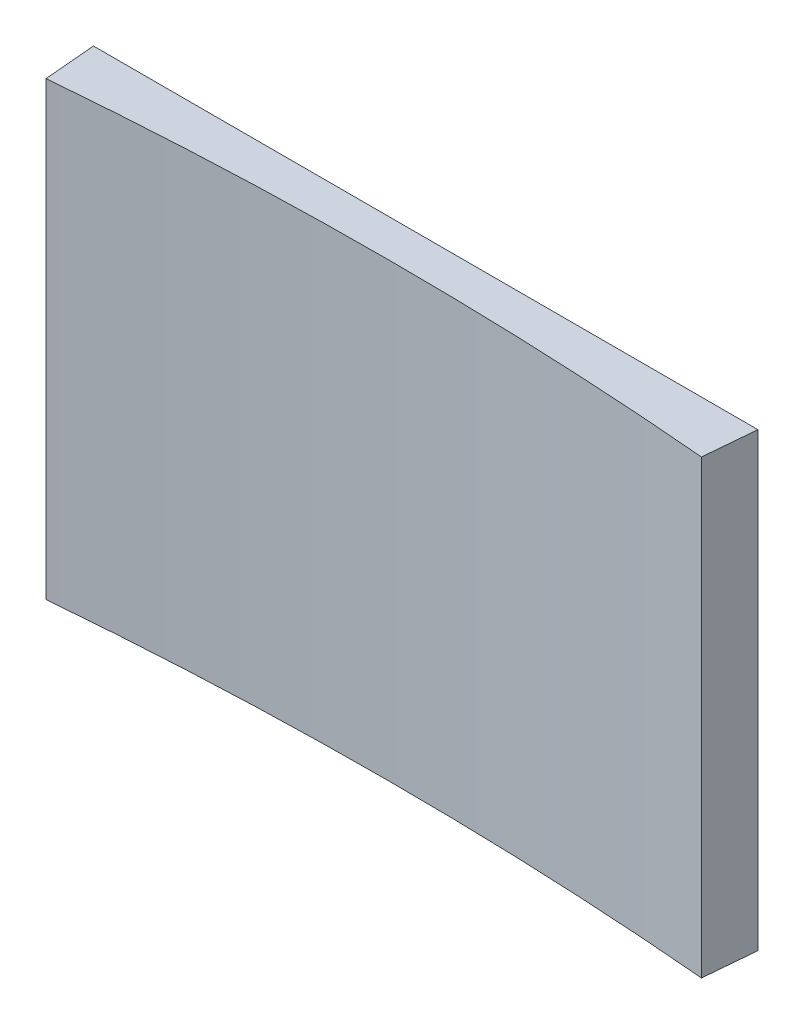
ISO-10303-21;
HEADER;
FILE_DESCRIPTION(('STEP AP214'),'2;1');
FILE_NAME('part.step','',(''),(''),'','','');
FILE_SCHEMA(('AUTOMOTIVE_DESIGN { 1 0 10303 214 1 1 1 1 }'));
ENDSEC;
DATA;
#1=APPLICATION_CONTEXT('core data for automotive mechanical design processes');
#2=APPLICATION_PROTOCOL_DEFINITION('international standard','automotive_design',2000,#1);
#3=PRODUCT_CONTEXT('',#1,'mechanical');
#4=PRODUCT('Part','Part','',(#3));
#5=PRODUCT_RELATED_PRODUCT_CATEGORY('part','',(#4));
#6=PRODUCT_DEFINITION_FORMATION('','',#4);
#7=PRODUCT_DEFINITION_CONTEXT('part definition',#1,'design');
#8=PRODUCT_DEFINITION('design','',#6,#7);
#9=PRODUCT_DEFINITION_SHAPE('','',#8);
#10=(LENGTH_UNIT() NAMED_UNIT(*) SI_UNIT(.MILLI.,.METRE.));
#11=(NAMED_UNIT(*) PLANE_ANGLE_UNIT() SI_UNIT($,.RADIAN.));
#12=(NAMED_UNIT(*) SI_UNIT($,.STERADIAN.) SOLID_ANGLE_UNIT());
#13=UNCERTAINTY_MEASURE_WITH_UNIT(LENGTH_MEASURE(1.E-05),#10,'distance_accuracy_value','');
#14=(GEOMETRIC_REPRESENTATION_CONTEXT(3) GLOBAL_UNCERTAINTY_ASSIGNED_CONTEXT((#13)) GLOBAL_UNIT_ASSIGNED_CONTEXT((#10,
#11,#12)) REPRESENTATION_CONTEXT('',''));
#15=CARTESIAN_POINT('',(0.,0.,0.));
#16=DIRECTION('',(0.,0.,1.));
#17=DIRECTION('',(1.,0.,0.));
#18=AXIS2_PLACEMENT_3D('',#15,#16,#17);
#19=CARTESIAN_POINT('',(0.,6.,0.));
#20=DIRECTION('',(0.,-1.,0.));
#21=DIRECTION('',(0.,0.,-1.));
#22=AXIS2_PLACEMENT_3D('',#19,#20,#21);
#23=CYLINDRICAL_SURFACE('',#22,50.);
#24=CARTESIAN_POINT('',(0.,0.,0.));
#25=DIRECTION('',(0.,-1.,0.));
#26=DIRECTION('',(0.,0.,1.));
#27=AXIS2_PLACEMENT_3D('',#24,#25,#26);
#28=CIRCLE('',#27,50.);
#29=CARTESIAN_POINT('',(-4.35778713738291,0.,-49.8097349045873));
#30=VERTEX_POINT('',#29);
#31=CARTESIAN_POINT('',(4.35778713738291,0.,-49.8097349045873));
#32=VERTEX_POINT('',#31);
#33=EDGE_CURVE('E96',#30,#32,#28,.T.);
#34=ORIENTED_EDGE('',*,*,#33,.T.);
#35=DIRECTION('',(0.,-1.,0.));
#36=VECTOR('',#35,1.);
#37=CARTESIAN_POINT('',(4.35778713738291,6.,-49.8097349045873));
#38=LINE('',#37,#36);
#39=CARTESIAN_POINT('',(4.35778713738291,6.,-49.8097349045873));
#40=VERTEX_POINT('',#39);
#41=EDGE_CURVE('E11',#40,#32,#38,.T.);
#42=ORIENTED_EDGE('',*,*,#41,.F.);
#43=CARTESIAN_POINT('',(0.,6.,0.));
#44=DIRECTION('',(0.,-1.,0.));
#45=DIRECTION('',(0.,0.,1.));
#46=AXIS2_PLACEMENT_3D('',#43,#44,#45);
#47=CIRCLE('',#46,50.);
#48=CARTESIAN_POINT('',(-4.35778713738291,6.,-49.8097349045873));
#49=VERTEX_POINT('',#48);
#50=EDGE_CURVE('E84',#49,#40,#47,.T.);
#51=ORIENTED_EDGE('',*,*,#50,.F.);
#52=DIRECTION('',(0.,-1.,0.));
#53=VECTOR('',#52,1.);
#54=CARTESIAN_POINT('',(-4.35778713738291,6.,-49.8097349045873));
#55=LINE('',#54,#53);
#56=EDGE_CURVE('E92',#49,#30,#55,.T.);
#57=ORIENTED_EDGE('',*,*,#56,.T.);
#58=EDGE_LOOP('',(#34,#42,#51,#57));
#59=FACE_BOUND('',#58,.T.);
#60=ADVANCED_FACE('F33',(#59),#23,.F.);
#61=CARTESIAN_POINT('',(4.35778713738291,6.,-49.8097349045873));
#62=DIRECTION('',(-0.996194698091745,0.,-0.0871557427476602));
#63=DIRECTION('',(-0.0871557427476602,0.,0.996194698091745));
#64=AXIS2_PLACEMENT_3D('',#61,#62,#63);
#65=PLANE('',#64);
#66=DIRECTION('',(0.0871557427476602,0.,-0.996194698091745));
#67=VECTOR('',#66,1.);
#68=CARTESIAN_POINT('',(4.35778713738291,0.,-49.8097349045873));
#69=LINE('',#68,#67);
#70=CARTESIAN_POINT('',(4.41817750805917,0.,-50.5));
#71=VERTEX_POINT('',#70);
#72=EDGE_CURVE('E88',#32,#71,#69,.T.);
#73=ORIENTED_EDGE('',*,*,#72,.T.);
#74=DIRECTION('',(0.,-1.,0.));
#75=VECTOR('',#74,1.);
#76=CARTESIAN_POINT('',(4.41817750805917,6.,-50.5));
#77=LINE('',#76,#75);
#78=CARTESIAN_POINT('',(4.41817750805917,6.,-50.5));
#79=VERTEX_POINT('',#78);
#80=EDGE_CURVE('E41',#79,#71,#77,.T.);
#81=ORIENTED_EDGE('',*,*,#80,.F.);
#82=DIRECTION('',(0.0871557427476602,0.,-0.996194698091745));
#83=VECTOR('',#82,1.);
#84=CARTESIAN_POINT('',(4.35778713738291,6.,-49.8097349045873));
#85=LINE('',#84,#83);
#86=EDGE_CURVE('E79',#40,#79,#85,.T.);
#87=ORIENTED_EDGE('',*,*,#86,.F.);
#88=ORIENTED_EDGE('',*,*,#41,.T.);
#89=EDGE_LOOP('',(#73,#81,#87,#88));
#90=FACE_BOUND('',#89,.T.);
#91=ADVANCED_FACE('F87',(#90),#65,.F.);
#92=CARTESIAN_POINT('',(-4.41817750805917,6.,-50.5));
#93=DIRECTION('',(0.,0.,1.));
#94=DIRECTION('',(1.,0.,0.));
#95=AXIS2_PLACEMENT_3D('',#92,#93,#94);
#96=PLANE('',#95);
#97=DIRECTION('',(-1.,0.,0.));
#98=VECTOR('',#97,1.);
#99=CARTESIAN_POINT('',(-4.41817750805917,0.,-50.5));
#100=LINE('',#99,#98);
#101=CARTESIAN_POINT('',(-4.41817750805917,0.,-50.5));
#102=VERTEX_POINT('',#101);
#103=EDGE_CURVE('E66',#71,#102,#100,.T.);
#104=ORIENTED_EDGE('',*,*,#103,.T.);
#105=DIRECTION('',(0.,-1.,0.));
#106=VECTOR('',#105,1.);
#107=CARTESIAN_POINT('',(-4.41817750805917,6.,-50.5));
#108=LINE('',#107,#106);
#109=CARTESIAN_POINT('',(-4.41817750805917,6.,-50.5));
#110=VERTEX_POINT('',#109);
#111=EDGE_CURVE('E89',#110,#102,#108,.T.);
#112=ORIENTED_EDGE('',*,*,#111,.F.);
#113=DIRECTION('',(-1.,0.,0.));
#114=VECTOR('',#113,1.);
#115=CARTESIAN_POINT('',(-4.41817750805917,6.,-50.5));
#116=LINE('',#115,#114);
#117=EDGE_CURVE('E82',#79,#110,#116,.T.);
#118=ORIENTED_EDGE('',*,*,#117,.F.);
#119=ORIENTED_EDGE('',*,*,#80,.T.);
#120=EDGE_LOOP('',(#104,#112,#118,#119));
#121=FACE_BOUND('',#120,.T.);
#122=ADVANCED_FACE('F90',(#121),#96,.F.);
#123=CARTESIAN_POINT('',(-4.35778713738291,6.,-49.8097349045873));
#124=DIRECTION('',(0.996194698091745,0.,-0.087155742747659));
#125=DIRECTION('',(-0.087155742747659,0.,-0.996194698091746));
#126=AXIS2_PLACEMENT_3D('',#123,#124,#125);
#127=PLANE('',#126);
#128=DIRECTION('',(0.087155742747659,0.,0.996194698091746));
#129=VECTOR('',#128,1.);
#130=CARTESIAN_POINT('',(-4.35778713738291,0.,-49.8097349045873));
#131=LINE('',#130,#129);
#132=EDGE_CURVE('E72',#102,#30,#131,.T.);
#133=ORIENTED_EDGE('',*,*,#132,.T.);
#134=ORIENTED_EDGE('',*,*,#56,.F.);
#135=DIRECTION('',(0.087155742747659,0.,0.996194698091746));
#136=VECTOR('',#135,1.);
#137=CARTESIAN_POINT('',(-4.35778713738291,6.,-49.8097349045873));
#138=LINE('',#137,#136);
#139=EDGE_CURVE('E49',#110,#49,#138,.T.);
#140=ORIENTED_EDGE('',*,*,#139,.F.);
#141=ORIENTED_EDGE('',*,*,#111,.T.);
#142=EDGE_LOOP('',(#133,#134,#140,#141));
#143=FACE_BOUND('',#142,.T.);
#144=ADVANCED_FACE('F103',(#143),#127,.F.);
#145=CARTESIAN_POINT('',(0.,6.,0.));
#146=DIRECTION('',(0.,1.,0.));
#147=DIRECTION('',(0.,0.,1.));
#148=AXIS2_PLACEMENT_3D('',#145,#146,#147);
#149=PLANE('',#148);
#150=ORIENTED_EDGE('',*,*,#50,.T.);
#151=ORIENTED_EDGE('',*,*,#86,.T.);
#152=ORIENTED_EDGE('',*,*,#117,.T.);
#153=ORIENTED_EDGE('',*,*,#139,.T.);
#154=EDGE_LOOP('',(#150,#151,#152,#153));
#155=FACE_BOUND('',#154,.T.);
#156=ADVANCED_FACE('F80',(#155),#149,.T.);
#157=CARTESIAN_POINT('',(0.,0.,0.));
#158=DIRECTION('',(0.,1.,0.));
#159=DIRECTION('',(0.,0.,1.));
#160=AXIS2_PLACEMENT_3D('',#157,#158,#159);
#161=PLANE('',#160);
#162=ORIENTED_EDGE('',*,*,#33,.F.);
#163=ORIENTED_EDGE('',*,*,#132,.F.);
#164=ORIENTED_EDGE('',*,*,#103,.F.);
#165=ORIENTED_EDGE('',*,*,#72,.F.);
#166=EDGE_LOOP('',(#162,#163,#164,#165));
#167=FACE_BOUND('',#166,.T.);
#168=ADVANCED_FACE('F106',(#167),#161,.F.);
#169=CLOSED_SHELL('',(#60,#91,#122,#144,#156,#168));
#170=MANIFOLD_SOLID_BREP('B2',#169);
#171=ADVANCED_BREP_SHAPE_REPRESENTATION('',(#18,#170),#14);
#172=SHAPE_DEFINITION_REPRESENTATION(#9,#171);
ENDSEC;
END-ISO-10303-21;
